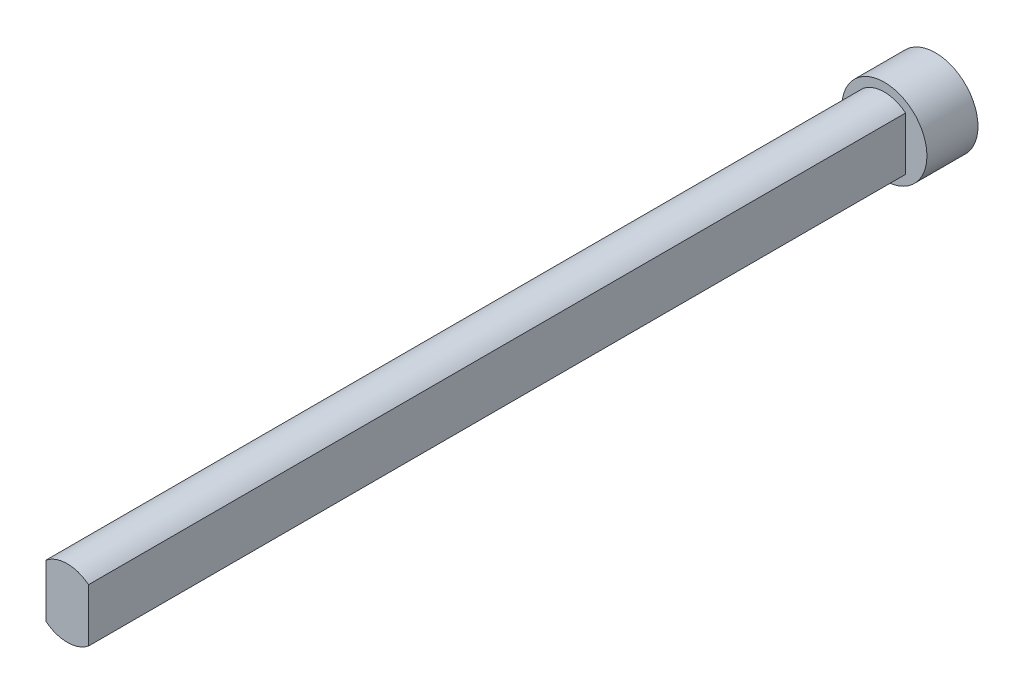
ISO-10303-21;
HEADER;
FILE_DESCRIPTION(('STEP AP214'),'2;1');
FILE_NAME('part.step','',(''),(''),'','','');
FILE_SCHEMA(('AUTOMOTIVE_DESIGN { 1 0 10303 214 1 1 1 1 }'));
ENDSEC;
DATA;
#1=APPLICATION_CONTEXT('core data for automotive mechanical design processes');
#2=APPLICATION_PROTOCOL_DEFINITION('international standard','automotive_design',2000,#1);
#3=PRODUCT_CONTEXT('',#1,'mechanical');
#4=PRODUCT('Part','Part','',(#3));
#5=PRODUCT_RELATED_PRODUCT_CATEGORY('part','',(#4));
#6=PRODUCT_DEFINITION_FORMATION('','',#4);
#7=PRODUCT_DEFINITION_CONTEXT('part definition',#1,'design');
#8=PRODUCT_DEFINITION('design','',#6,#7);
#9=PRODUCT_DEFINITION_SHAPE('','',#8);
#10=(LENGTH_UNIT() NAMED_UNIT(*) SI_UNIT(.MILLI.,.METRE.));
#11=(NAMED_UNIT(*) PLANE_ANGLE_UNIT() SI_UNIT($,.RADIAN.));
#12=(NAMED_UNIT(*) SI_UNIT($,.STERADIAN.) SOLID_ANGLE_UNIT());
#13=UNCERTAINTY_MEASURE_WITH_UNIT(LENGTH_MEASURE(1.E-05),#10,'distance_accuracy_value','');
#14=(GEOMETRIC_REPRESENTATION_CONTEXT(3) GLOBAL_UNCERTAINTY_ASSIGNED_CONTEXT((#13)) GLOBAL_UNIT_ASSIGNED_CONTEXT((#10,
#11,#12)) REPRESENTATION_CONTEXT('',''));
#15=CARTESIAN_POINT('',(0.,0.,0.));
#16=DIRECTION('',(0.,0.,1.));
#17=DIRECTION('',(1.,0.,0.));
#18=AXIS2_PLACEMENT_3D('',#15,#16,#17);
#19=CARTESIAN_POINT('',(0.,0.,102.));
#20=DIRECTION('',(0.,0.,-1.));
#21=DIRECTION('',(-1.,0.,0.));
#22=AXIS2_PLACEMENT_3D('',#19,#20,#21);
#23=CYLINDRICAL_SURFACE('',#22,4.);
#24=DIRECTION('',(0.,0.,-1.));
#25=VECTOR('',#24,1.);
#26=CARTESIAN_POINT('',(-2.5,3.1224989991992,102.));
#27=LINE('',#26,#25);
#28=CARTESIAN_POINT('',(-2.5,3.1224989991992,102.));
#29=VERTEX_POINT('',#28);
#30=CARTESIAN_POINT('',(-2.5,3.1224989991992,6.00000000000001));
#31=VERTEX_POINT('',#30);
#32=EDGE_CURVE('E134',#29,#31,#27,.T.);
#33=ORIENTED_EDGE('',*,*,#32,.F.);
#34=CARTESIAN_POINT('',(0.,0.,102.));
#35=DIRECTION('',(0.,0.,1.));
#36=DIRECTION('',(1.,0.,0.));
#37=AXIS2_PLACEMENT_3D('',#34,#35,#36);
#38=CIRCLE('',#37,4.);
#39=CARTESIAN_POINT('',(2.5,3.1224989991992,102.));
#40=VERTEX_POINT('',#39);
#41=EDGE_CURVE('E106',#40,#29,#38,.T.);
#42=ORIENTED_EDGE('',*,*,#41,.F.);
#43=DIRECTION('',(0.,0.,-1.));
#44=VECTOR('',#43,1.);
#45=CARTESIAN_POINT('',(2.5,3.1224989991992,102.));
#46=LINE('',#45,#44);
#47=CARTESIAN_POINT('',(2.5,3.1224989991992,6.00000000000001));
#48=VERTEX_POINT('',#47);
#49=EDGE_CURVE('E73',#48,#40,#46,.F.);
#50=ORIENTED_EDGE('',*,*,#49,.F.);
#51=CARTESIAN_POINT('',(0.,0.,6.));
#52=DIRECTION('',(0.,0.,1.));
#53=DIRECTION('',(1.,0.,0.));
#54=AXIS2_PLACEMENT_3D('',#51,#52,#53);
#55=CIRCLE('',#54,4.);
#56=EDGE_CURVE('E104',#48,#31,#55,.T.);
#57=ORIENTED_EDGE('',*,*,#56,.T.);
#58=EDGE_LOOP('',(#33,#42,#50,#57));
#59=FACE_BOUND('',#58,.T.);
#60=ADVANCED_FACE('F50',(#59),#23,.T.);
#61=DIRECTION('',(0.,0.,-1.));
#62=VECTOR('',#61,1.);
#63=CARTESIAN_POINT('',(-2.5,-3.1224989991992,102.));
#64=LINE('',#63,#62);
#65=CARTESIAN_POINT('',(-2.5,-3.1224989991992,6.00000000000001));
#66=VERTEX_POINT('',#65);
#67=CARTESIAN_POINT('',(-2.5,-3.1224989991992,102.));
#68=VERTEX_POINT('',#67);
#69=EDGE_CURVE('E66',#66,#68,#64,.F.);
#70=ORIENTED_EDGE('',*,*,#69,.F.);
#71=CARTESIAN_POINT('',(2.5,-3.1224989991992,6.00000000000001));
#72=VERTEX_POINT('',#71);
#73=EDGE_CURVE('E113',#66,#72,#55,.T.);
#74=ORIENTED_EDGE('',*,*,#73,.T.);
#75=DIRECTION('',(0.,0.,-1.));
#76=VECTOR('',#75,1.);
#77=CARTESIAN_POINT('',(2.5,-3.1224989991992,102.));
#78=LINE('',#77,#76);
#79=CARTESIAN_POINT('',(2.5,-3.1224989991992,102.));
#80=VERTEX_POINT('',#79);
#81=EDGE_CURVE('E92',#80,#72,#78,.T.);
#82=ORIENTED_EDGE('',*,*,#81,.F.);
#83=EDGE_CURVE('E130',#68,#80,#38,.T.);
#84=ORIENTED_EDGE('',*,*,#83,.F.);
#85=EDGE_LOOP('',(#70,#74,#82,#84));
#86=FACE_BOUND('',#85,.T.);
#87=ADVANCED_FACE('F146',(#86),#23,.T.);
#88=CARTESIAN_POINT('',(0.,0.,102.));
#89=DIRECTION('',(0.,0.,1.));
#90=DIRECTION('',(1.,0.,0.));
#91=AXIS2_PLACEMENT_3D('',#88,#89,#90);
#92=PLANE('',#91);
#93=ORIENTED_EDGE('',*,*,#41,.T.);
#94=DIRECTION('',(0.,-1.,0.));
#95=VECTOR('',#94,1.);
#96=CARTESIAN_POINT('',(-2.5,0.,102.));
#97=LINE('',#96,#95);
#98=EDGE_CURVE('E12',#29,#68,#97,.T.);
#99=ORIENTED_EDGE('',*,*,#98,.T.);
#100=ORIENTED_EDGE('',*,*,#83,.T.);
#101=DIRECTION('',(0.,1.,0.));
#102=VECTOR('',#101,1.);
#103=CARTESIAN_POINT('',(2.5,0.,102.));
#104=LINE('',#103,#102);
#105=EDGE_CURVE('E59',#80,#40,#104,.T.);
#106=ORIENTED_EDGE('',*,*,#105,.T.);
#107=EDGE_LOOP('',(#93,#99,#100,#106));
#108=FACE_BOUND('',#107,.T.);
#109=ADVANCED_FACE('F144',(#108),#92,.T.);
#110=CARTESIAN_POINT('',(0.,0.,6.));
#111=DIRECTION('',(0.,0.,-1.));
#112=DIRECTION('',(-1.,0.,0.));
#113=AXIS2_PLACEMENT_3D('',#110,#111,#112);
#114=CYLINDRICAL_SURFACE('',#113,5.);
#115=CARTESIAN_POINT('',(0.,0.,6.));
#116=DIRECTION('',(0.,0.,1.));
#117=DIRECTION('',(1.,0.,0.));
#118=AXIS2_PLACEMENT_3D('',#115,#116,#117);
#119=CIRCLE('',#118,5.);
#120=CARTESIAN_POINT('',(5.,0.,6.));
#121=VERTEX_POINT('',#120);
#122=EDGE_CURVE('E117',#121,#121,#119,.T.);
#123=ORIENTED_EDGE('',*,*,#122,.F.);
#124=EDGE_LOOP('',(#123));
#125=FACE_BOUND('',#124,.T.);
#126=CARTESIAN_POINT('',(0.,0.,0.));
#127=DIRECTION('',(0.,0.,1.));
#128=DIRECTION('',(1.,0.,0.));
#129=AXIS2_PLACEMENT_3D('',#126,#127,#128);
#130=CIRCLE('',#129,5.);
#131=CARTESIAN_POINT('',(5.,0.,0.));
#132=VERTEX_POINT('',#131);
#133=EDGE_CURVE('E124',#132,#132,#130,.T.);
#134=ORIENTED_EDGE('',*,*,#133,.T.);
#135=EDGE_LOOP('',(#134));
#136=FACE_BOUND('',#135,.T.);
#137=ADVANCED_FACE('F52',(#125,#136),#114,.T.);
#138=CARTESIAN_POINT('',(0.,0.,6.));
#139=DIRECTION('',(0.,0.,1.));
#140=DIRECTION('',(1.,0.,0.));
#141=AXIS2_PLACEMENT_3D('',#138,#139,#140);
#142=PLANE('',#141);
#143=DIRECTION('',(0.,1.,0.));
#144=VECTOR('',#143,1.);
#145=CARTESIAN_POINT('',(-2.5,8.21549332212399,6.));
#146=LINE('',#145,#144);
#147=EDGE_CURVE('E98',#66,#31,#146,.T.);
#148=ORIENTED_EDGE('',*,*,#147,.T.);
#149=ORIENTED_EDGE('',*,*,#56,.F.);
#150=DIRECTION('',(0.,-1.,0.));
#151=VECTOR('',#150,1.);
#152=CARTESIAN_POINT('',(2.5,8.21549332212399,6.));
#153=LINE('',#152,#151);
#154=EDGE_CURVE('E89',#48,#72,#153,.T.);
#155=ORIENTED_EDGE('',*,*,#154,.T.);
#156=ORIENTED_EDGE('',*,*,#73,.F.);
#157=EDGE_LOOP('',(#148,#149,#155,#156));
#158=FACE_BOUND('',#157,.T.);
#159=ORIENTED_EDGE('',*,*,#122,.T.);
#160=EDGE_LOOP('',(#159));
#161=FACE_BOUND('',#160,.T.);
#162=ADVANCED_FACE('F110',(#158,#161),#142,.T.);
#163=CARTESIAN_POINT('',(0.,0.,0.));
#164=DIRECTION('',(0.,0.,1.));
#165=DIRECTION('',(1.,0.,0.));
#166=AXIS2_PLACEMENT_3D('',#163,#164,#165);
#167=PLANE('',#166);
#168=ORIENTED_EDGE('',*,*,#133,.F.);
#169=EDGE_LOOP('',(#168));
#170=FACE_BOUND('',#169,.T.);
#171=ADVANCED_FACE('F157',(#170),#167,.F.);
#172=CARTESIAN_POINT('',(2.5,8.21549332212399,-18.3987458474603));
#173=DIRECTION('',(1.,0.,0.));
#174=DIRECTION('',(0.,1.,0.));
#175=AXIS2_PLACEMENT_3D('',#172,#173,#174);
#176=PLANE('',#175);
#177=ORIENTED_EDGE('',*,*,#81,.T.);
#178=ORIENTED_EDGE('',*,*,#154,.F.);
#179=ORIENTED_EDGE('',*,*,#49,.T.);
#180=ORIENTED_EDGE('',*,*,#105,.F.);
#181=EDGE_LOOP('',(#177,#178,#179,#180));
#182=FACE_BOUND('',#181,.T.);
#183=ADVANCED_FACE('F90',(#182),#176,.T.);
#184=CARTESIAN_POINT('',(-2.5,8.21549332212399,-18.3987458474603));
#185=DIRECTION('',(-1.,0.,0.));
#186=DIRECTION('',(0.,-1.,0.));
#187=AXIS2_PLACEMENT_3D('',#184,#185,#186);
#188=PLANE('',#187);
#189=ORIENTED_EDGE('',*,*,#32,.T.);
#190=ORIENTED_EDGE('',*,*,#147,.F.);
#191=ORIENTED_EDGE('',*,*,#69,.T.);
#192=ORIENTED_EDGE('',*,*,#98,.F.);
#193=EDGE_LOOP('',(#189,#190,#191,#192));
#194=FACE_BOUND('',#193,.T.);
#195=ADVANCED_FACE('F143',(#194),#188,.T.);
#196=CLOSED_SHELL('',(#60,#87,#109,#137,#162,#171,#183,#195));
#197=MANIFOLD_SOLID_BREP('B2',#196);
#198=ADVANCED_BREP_SHAPE_REPRESENTATION('',(#18,#197),#14);
#199=SHAPE_DEFINITION_REPRESENTATION(#9,#198);
ENDSEC;
END-ISO-10303-21;
